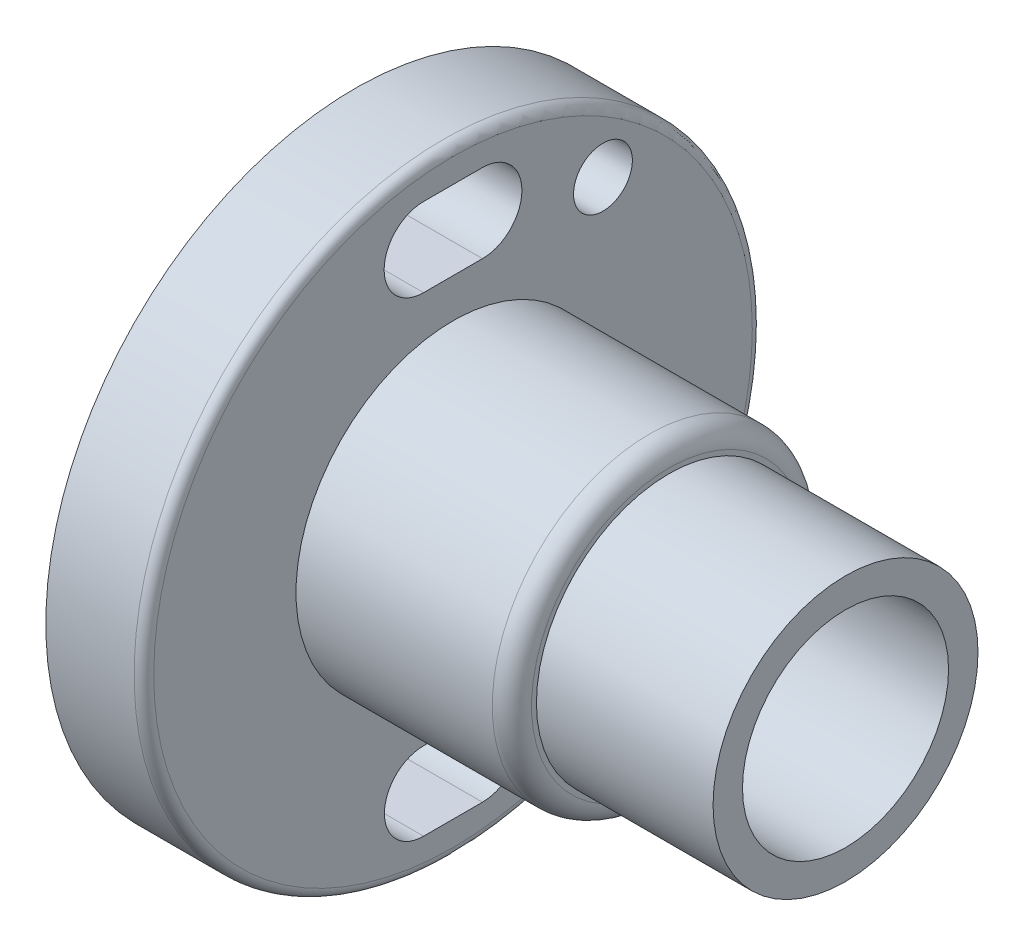
ISO-10303-21;
HEADER;
FILE_DESCRIPTION(('STEP AP214'),'2;1');
FILE_NAME('part.step','',(''),(''),'','','');
FILE_SCHEMA(('AUTOMOTIVE_DESIGN { 1 0 10303 214 1 1 1 1 }'));
ENDSEC;
DATA;
#1=APPLICATION_CONTEXT('core data for automotive mechanical design processes');
#2=APPLICATION_PROTOCOL_DEFINITION('international standard','automotive_design',2000,#1);
#3=PRODUCT_CONTEXT('',#1,'mechanical');
#4=PRODUCT('Part','Part','',(#3));
#5=PRODUCT_RELATED_PRODUCT_CATEGORY('part','',(#4));
#6=PRODUCT_DEFINITION_FORMATION('','',#4);
#7=PRODUCT_DEFINITION_CONTEXT('part definition',#1,'design');
#8=PRODUCT_DEFINITION('design','',#6,#7);
#9=PRODUCT_DEFINITION_SHAPE('','',#8);
#10=(LENGTH_UNIT() NAMED_UNIT(*) SI_UNIT(.MILLI.,.METRE.));
#11=(NAMED_UNIT(*) PLANE_ANGLE_UNIT() SI_UNIT($,.RADIAN.));
#12=(NAMED_UNIT(*) SI_UNIT($,.STERADIAN.) SOLID_ANGLE_UNIT());
#13=UNCERTAINTY_MEASURE_WITH_UNIT(LENGTH_MEASURE(1.E-05),#10,'distance_accuracy_value','');
#14=(GEOMETRIC_REPRESENTATION_CONTEXT(3) GLOBAL_UNCERTAINTY_ASSIGNED_CONTEXT((#13)) GLOBAL_UNIT_ASSIGNED_CONTEXT((#10,
#11,#12)) REPRESENTATION_CONTEXT('',''));
#15=CARTESIAN_POINT('',(0.,0.,0.));
#16=DIRECTION('',(0.,0.,1.));
#17=DIRECTION('',(1.,0.,0.));
#18=AXIS2_PLACEMENT_3D('',#15,#16,#17);
#19=CARTESIAN_POINT('',(5.5,0.,0.));
#20=DIRECTION('',(-1.,0.,0.));
#21=DIRECTION('',(0.,0.,1.));
#22=AXIS2_PLACEMENT_3D('',#19,#20,#21);
#23=CYLINDRICAL_SURFACE('',#22,16.);
#24=CARTESIAN_POINT('',(5.5,0.,0.));
#25=DIRECTION('',(-1.,0.,0.));
#26=DIRECTION('',(0.,0.,1.));
#27=AXIS2_PLACEMENT_3D('',#24,#25,#26);
#28=CIRCLE('',#27,16.);
#29=CARTESIAN_POINT('',(5.5,0.,16.));
#30=VERTEX_POINT('',#29);
#31=EDGE_CURVE('E215',#30,#30,#28,.T.);
#32=ORIENTED_EDGE('',*,*,#31,.F.);
#33=EDGE_LOOP('',(#32));
#34=FACE_BOUND('',#33,.T.);
#35=CARTESIAN_POINT('',(2.5,0.,0.));
#36=DIRECTION('',(-1.,0.,0.));
#37=DIRECTION('',(0.,0.,1.));
#38=AXIS2_PLACEMENT_3D('',#35,#36,#37);
#39=CIRCLE('',#38,16.);
#40=CARTESIAN_POINT('',(2.5,0.,16.));
#41=VERTEX_POINT('',#40);
#42=EDGE_CURVE('E210',#41,#41,#39,.F.);
#43=ORIENTED_EDGE('',*,*,#42,.F.);
#44=EDGE_LOOP('',(#43));
#45=FACE_BOUND('',#44,.T.);
#46=ADVANCED_FACE('F39',(#34,#45),#23,.F.);
#47=CARTESIAN_POINT('',(15.5,0.,0.));
#48=DIRECTION('',(-1.,0.,0.));
#49=DIRECTION('',(0.,0.,1.));
#50=AXIS2_PLACEMENT_3D('',#47,#48,#49);
#51=CYLINDRICAL_SURFACE('',#50,14.5);
#52=CARTESIAN_POINT('',(15.5,0.,0.));
#53=DIRECTION('',(-1.,0.,0.));
#54=DIRECTION('',(0.,0.,1.));
#55=AXIS2_PLACEMENT_3D('',#52,#53,#54);
#56=CIRCLE('',#55,14.5);
#57=CARTESIAN_POINT('',(15.5,0.,14.5));
#58=VERTEX_POINT('',#57);
#59=EDGE_CURVE('E220',#58,#58,#56,.T.);
#60=ORIENTED_EDGE('',*,*,#59,.F.);
#61=EDGE_LOOP('',(#60));
#62=FACE_BOUND('',#61,.T.);
#63=CARTESIAN_POINT('',(5.5,0.,0.));
#64=DIRECTION('',(-1.,0.,0.));
#65=DIRECTION('',(0.,0.,1.));
#66=AXIS2_PLACEMENT_3D('',#63,#64,#65);
#67=CIRCLE('',#66,14.5);
#68=CARTESIAN_POINT('',(5.5,0.,14.5));
#69=VERTEX_POINT('',#68);
#70=EDGE_CURVE('E219',#69,#69,#67,.F.);
#71=ORIENTED_EDGE('',*,*,#70,.F.);
#72=EDGE_LOOP('',(#71));
#73=FACE_BOUND('',#72,.T.);
#74=ADVANCED_FACE('F284',(#62,#73),#51,.F.);
#75=CARTESIAN_POINT('',(17.7,0.,0.));
#76=DIRECTION('',(-1.,0.,0.));
#77=DIRECTION('',(0.,0.,1.));
#78=AXIS2_PLACEMENT_3D('',#75,#76,#77);
#79=CYLINDRICAL_SURFACE('',#78,13.95);
#80=CARTESIAN_POINT('',(17.7,0.,0.));
#81=DIRECTION('',(-1.,0.,0.));
#82=DIRECTION('',(0.,0.,1.));
#83=AXIS2_PLACEMENT_3D('',#80,#81,#82);
#84=CIRCLE('',#83,13.95);
#85=CARTESIAN_POINT('',(17.7,0.,13.95));
#86=VERTEX_POINT('',#85);
#87=EDGE_CURVE('E225',#86,#86,#84,.T.);
#88=ORIENTED_EDGE('',*,*,#87,.F.);
#89=EDGE_LOOP('',(#88));
#90=FACE_BOUND('',#89,.T.);
#91=CARTESIAN_POINT('',(15.5,0.,0.));
#92=DIRECTION('',(-1.,0.,0.));
#93=DIRECTION('',(0.,0.,1.));
#94=AXIS2_PLACEMENT_3D('',#91,#92,#93);
#95=CIRCLE('',#94,13.95);
#96=CARTESIAN_POINT('',(15.5,0.,13.95));
#97=VERTEX_POINT('',#96);
#98=EDGE_CURVE('E224',#97,#97,#95,.F.);
#99=ORIENTED_EDGE('',*,*,#98,.F.);
#100=EDGE_LOOP('',(#99));
#101=FACE_BOUND('',#100,.T.);
#102=ADVANCED_FACE('F290',(#90,#101),#79,.F.);
#103=CARTESIAN_POINT('',(23.5,0.,0.));
#104=DIRECTION('',(-1.,0.,0.));
#105=DIRECTION('',(0.,0.,1.));
#106=AXIS2_PLACEMENT_3D('',#103,#104,#105);
#107=CYLINDRICAL_SURFACE('',#106,12.7);
#108=CARTESIAN_POINT('',(23.5,0.,0.));
#109=DIRECTION('',(-1.,0.,0.));
#110=DIRECTION('',(0.,0.,1.));
#111=AXIS2_PLACEMENT_3D('',#108,#109,#110);
#112=CIRCLE('',#111,12.7);
#113=CARTESIAN_POINT('',(23.5,0.,12.7));
#114=VERTEX_POINT('',#113);
#115=EDGE_CURVE('E230',#114,#114,#112,.T.);
#116=ORIENTED_EDGE('',*,*,#115,.F.);
#117=EDGE_LOOP('',(#116));
#118=FACE_BOUND('',#117,.T.);
#119=CARTESIAN_POINT('',(17.7,0.,0.));
#120=DIRECTION('',(-1.,0.,0.));
#121=DIRECTION('',(0.,0.,1.));
#122=AXIS2_PLACEMENT_3D('',#119,#120,#121);
#123=CIRCLE('',#122,12.7);
#124=CARTESIAN_POINT('',(17.7,0.,12.7));
#125=VERTEX_POINT('',#124);
#126=EDGE_CURVE('E229',#125,#125,#123,.F.);
#127=ORIENTED_EDGE('',*,*,#126,.F.);
#128=EDGE_LOOP('',(#127));
#129=FACE_BOUND('',#128,.T.);
#130=ADVANCED_FACE('F309',(#118,#129),#107,.F.);
#131=CARTESIAN_POINT('',(150.,0.,0.));
#132=DIRECTION('',(-1.,0.,0.));
#133=DIRECTION('',(0.,0.,1.));
#134=AXIS2_PLACEMENT_3D('',#131,#132,#133);
#135=CYLINDRICAL_SURFACE('',#134,10.5);
#136=CARTESIAN_POINT('',(50.,0.,0.));
#137=DIRECTION('',(1.,0.,0.));
#138=DIRECTION('',(0.,0.,-1.));
#139=AXIS2_PLACEMENT_3D('',#136,#137,#138);
#140=CIRCLE('',#139,10.5);
#141=CARTESIAN_POINT('',(50.,0.,-10.5));
#142=VERTEX_POINT('',#141);
#143=EDGE_CURVE('E240',#142,#142,#140,.T.);
#144=ORIENTED_EDGE('',*,*,#143,.T.);
#145=EDGE_LOOP('',(#144));
#146=FACE_BOUND('',#145,.T.);
#147=CARTESIAN_POINT('',(23.5,0.,0.));
#148=DIRECTION('',(-1.,0.,0.));
#149=DIRECTION('',(0.,0.,1.));
#150=AXIS2_PLACEMENT_3D('',#147,#148,#149);
#151=CIRCLE('',#150,10.5);
#152=CARTESIAN_POINT('',(23.5,0.,10.5));
#153=VERTEX_POINT('',#152);
#154=EDGE_CURVE('E234',#153,#153,#151,.F.);
#155=ORIENTED_EDGE('',*,*,#154,.F.);
#156=EDGE_LOOP('',(#155));
#157=FACE_BOUND('',#156,.T.);
#158=ADVANCED_FACE('F316',(#146,#157),#135,.F.);
#159=CARTESIAN_POINT('',(10.,0.,0.));
#160=DIRECTION('',(-1.,0.,0.));
#161=DIRECTION('',(0.,0.,1.));
#162=AXIS2_PLACEMENT_3D('',#159,#160,#161);
#163=CYLINDRICAL_SURFACE('',#162,31.5);
#164=CARTESIAN_POINT('',(9.,0.,0.));
#165=DIRECTION('',(1.,0.,0.));
#166=DIRECTION('',(0.,0.,-1.));
#167=AXIS2_PLACEMENT_3D('',#164,#165,#166);
#168=CIRCLE('',#167,31.5);
#169=CARTESIAN_POINT('',(9.,0.,-31.5));
#170=VERTEX_POINT('',#169);
#171=EDGE_CURVE('E256',#170,#170,#168,.F.);
#172=ORIENTED_EDGE('',*,*,#171,.T.);
#173=EDGE_LOOP('',(#172));
#174=FACE_BOUND('',#173,.T.);
#175=CARTESIAN_POINT('',(0.,0.,0.));
#176=DIRECTION('',(1.,0.,0.));
#177=DIRECTION('',(0.,0.,-1.));
#178=AXIS2_PLACEMENT_3D('',#175,#176,#177);
#179=CIRCLE('',#178,31.5);
#180=CARTESIAN_POINT('',(0.,0.,-31.5));
#181=VERTEX_POINT('',#180);
#182=EDGE_CURVE('E239',#181,#181,#179,.T.);
#183=ORIENTED_EDGE('',*,*,#182,.T.);
#184=EDGE_LOOP('',(#183));
#185=FACE_BOUND('',#184,.T.);
#186=ADVANCED_FACE('F320',(#174,#185),#163,.T.);
#187=CARTESIAN_POINT('',(10.,0.,0.));
#188=DIRECTION('',(1.,0.,0.));
#189=DIRECTION('',(0.,0.,-1.));
#190=AXIS2_PLACEMENT_3D('',#187,#188,#189);
#191=PLANE('',#190);
#192=CARTESIAN_POINT('',(10.,24.,-3.));
#193=DIRECTION('',(1.,0.,0.));
#194=DIRECTION('',(0.,0.,-1.));
#195=AXIS2_PLACEMENT_3D('',#192,#193,#194);
#196=CIRCLE('',#195,4.02084930156254);
#197=CARTESIAN_POINT('',(10.,19.9791506984375,-3.));
#198=VERTEX_POINT('',#197);
#199=CARTESIAN_POINT('',(10.,28.0208493015625,-3.));
#200=VERTEX_POINT('',#199);
#201=EDGE_CURVE('E150',#198,#200,#196,.T.);
#202=ORIENTED_EDGE('',*,*,#201,.F.);
#203=DIRECTION('',(0.,0.,-1.));
#204=VECTOR('',#203,1.);
#205=CARTESIAN_POINT('',(10.,19.9791506984375,0.));
#206=LINE('',#205,#204);
#207=CARTESIAN_POINT('',(10.,19.9791506984375,3.));
#208=VERTEX_POINT('',#207);
#209=EDGE_CURVE('E138',#208,#198,#206,.T.);
#210=ORIENTED_EDGE('',*,*,#209,.F.);
#211=CARTESIAN_POINT('',(10.,24.,3.));
#212=DIRECTION('',(1.,0.,0.));
#213=DIRECTION('',(0.,0.,-1.));
#214=AXIS2_PLACEMENT_3D('',#211,#212,#213);
#215=CIRCLE('',#214,4.02084930156254);
#216=CARTESIAN_POINT('',(10.,28.0208493015625,3.));
#217=VERTEX_POINT('',#216);
#218=EDGE_CURVE('E113',#217,#208,#215,.T.);
#219=ORIENTED_EDGE('',*,*,#218,.F.);
#220=DIRECTION('',(0.,0.,1.));
#221=VECTOR('',#220,1.);
#222=CARTESIAN_POINT('',(10.,28.0208493015625,0.));
#223=LINE('',#222,#221);
#224=EDGE_CURVE('E147',#200,#217,#223,.T.);
#225=ORIENTED_EDGE('',*,*,#224,.F.);
#226=EDGE_LOOP('',(#202,#210,#219,#225));
#227=FACE_BOUND('',#226,.T.);
#228=DIRECTION('',(0.,0.,-1.));
#229=VECTOR('',#228,1.);
#230=CARTESIAN_POINT('',(10.,-27.9908190041573,0.));
#231=LINE('',#230,#229);
#232=CARTESIAN_POINT('',(10.,-27.9908190041573,3.00000000000001));
#233=VERTEX_POINT('',#232);
#234=CARTESIAN_POINT('',(10.,-27.9908190041573,-2.99999999999999));
#235=VERTEX_POINT('',#234);
#236=EDGE_CURVE('E191',#233,#235,#231,.T.);
#237=ORIENTED_EDGE('',*,*,#236,.F.);
#238=CARTESIAN_POINT('',(10.,-24.,3.00000000000001));
#239=DIRECTION('',(1.,0.,0.));
#240=DIRECTION('',(0.,0.,-1.));
#241=AXIS2_PLACEMENT_3D('',#238,#239,#240);
#242=CIRCLE('',#241,3.99081900415731);
#243=CARTESIAN_POINT('',(10.,-20.0091809958427,3.00000000000001));
#244=VERTEX_POINT('',#243);
#245=EDGE_CURVE('E172',#244,#233,#242,.T.);
#246=ORIENTED_EDGE('',*,*,#245,.F.);
#247=DIRECTION('',(0.,0.,-1.));
#248=VECTOR('',#247,1.);
#249=CARTESIAN_POINT('',(10.,-20.0091809958427,0.));
#250=LINE('',#249,#248);
#251=CARTESIAN_POINT('',(10.,-20.0091809958427,-2.99999999999999));
#252=VERTEX_POINT('',#251);
#253=EDGE_CURVE('E184',#244,#252,#250,.T.);
#254=ORIENTED_EDGE('',*,*,#253,.T.);
#255=CARTESIAN_POINT('',(10.,-24.,-2.99999999999999));
#256=DIRECTION('',(1.,0.,0.));
#257=DIRECTION('',(0.,0.,-1.));
#258=AXIS2_PLACEMENT_3D('',#255,#256,#257);
#259=CIRCLE('',#258,3.99081900415731);
#260=EDGE_CURVE('E188',#235,#252,#259,.T.);
#261=ORIENTED_EDGE('',*,*,#260,.F.);
#262=EDGE_LOOP('',(#237,#246,#254,#261));
#263=FACE_BOUND('',#262,.T.);
#264=CARTESIAN_POINT('',(10.,-21.0344418537486,-15.2824165596043));
#265=DIRECTION('',(1.,0.,0.));
#266=DIRECTION('',(0.,0.,-1.));
#267=AXIS2_PLACEMENT_3D('',#264,#265,#266);
#268=CIRCLE('',#267,3.);
#269=CARTESIAN_POINT('',(10.,-21.0344418537486,-18.2824165596043));
#270=VERTEX_POINT('',#269);
#271=EDGE_CURVE('E198',#270,#270,#268,.T.);
#272=ORIENTED_EDGE('',*,*,#271,.F.);
#273=EDGE_LOOP('',(#272));
#274=FACE_BOUND('',#273,.T.);
#275=CARTESIAN_POINT('',(10.,21.0310693999118,-15.2799663284682));
#276=DIRECTION('',(1.,0.,0.));
#277=DIRECTION('',(0.,0.,-1.));
#278=AXIS2_PLACEMENT_3D('',#275,#276,#277);
#279=CIRCLE('',#278,3.);
#280=CARTESIAN_POINT('',(10.,21.0310693999118,-18.2799663284682));
#281=VERTEX_POINT('',#280);
#282=EDGE_CURVE('E202',#281,#281,#279,.T.);
#283=ORIENTED_EDGE('',*,*,#282,.F.);
#284=EDGE_LOOP('',(#283));
#285=FACE_BOUND('',#284,.T.);
#286=CARTESIAN_POINT('',(10.,0.,0.));
#287=DIRECTION('',(1.,0.,0.));
#288=DIRECTION('',(0.,0.,-1.));
#289=AXIS2_PLACEMENT_3D('',#286,#287,#288);
#290=CIRCLE('',#289,30.5);
#291=CARTESIAN_POINT('',(10.,0.,-30.5));
#292=VERTEX_POINT('',#291);
#293=EDGE_CURVE('E245',#292,#292,#290,.T.);
#294=ORIENTED_EDGE('',*,*,#293,.T.);
#295=EDGE_LOOP('',(#294));
#296=FACE_BOUND('',#295,.T.);
#297=CARTESIAN_POINT('',(10.,0.,0.));
#298=DIRECTION('',(1.,0.,0.));
#299=DIRECTION('',(0.,0.,-1.));
#300=AXIS2_PLACEMENT_3D('',#297,#298,#299);
#301=CIRCLE('',#300,16.);
#302=CARTESIAN_POINT('',(10.,0.,-16.));
#303=VERTEX_POINT('',#302);
#304=EDGE_CURVE('E246',#303,#303,#301,.T.);
#305=ORIENTED_EDGE('',*,*,#304,.F.);
#306=EDGE_LOOP('',(#305));
#307=FACE_BOUND('',#306,.T.);
#308=ADVANCED_FACE('F339',(#227,#263,#274,#285,#296,#307),#191,.T.);
#309=CARTESIAN_POINT('',(0.,0.,0.));
#310=DIRECTION('',(1.,0.,0.));
#311=DIRECTION('',(0.,0.,-1.));
#312=AXIS2_PLACEMENT_3D('',#309,#310,#311);
#313=PLANE('',#312);
#314=DIRECTION('',(0.,0.,1.));
#315=VECTOR('',#314,1.);
#316=CARTESIAN_POINT('',(0.,19.9791506984375,-3.));
#317=LINE('',#316,#315);
#318=CARTESIAN_POINT('',(0.,19.9791506984375,-3.));
#319=VERTEX_POINT('',#318);
#320=CARTESIAN_POINT('',(0.,19.9791506984375,3.));
#321=VERTEX_POINT('',#320);
#322=EDGE_CURVE('E120',#319,#321,#317,.T.);
#323=ORIENTED_EDGE('',*,*,#322,.F.);
#324=CARTESIAN_POINT('',(0.,24.,-3.));
#325=DIRECTION('',(-1.,0.,0.));
#326=DIRECTION('',(0.,0.,1.));
#327=AXIS2_PLACEMENT_3D('',#324,#325,#326);
#328=CIRCLE('',#327,4.02084930156254);
#329=CARTESIAN_POINT('',(0.,28.0208493015625,-3.));
#330=VERTEX_POINT('',#329);
#331=EDGE_CURVE('E65',#330,#319,#328,.T.);
#332=ORIENTED_EDGE('',*,*,#331,.F.);
#333=DIRECTION('',(0.,0.,-1.));
#334=VECTOR('',#333,1.);
#335=CARTESIAN_POINT('',(0.,28.0208493015625,-3.));
#336=LINE('',#335,#334);
#337=CARTESIAN_POINT('',(0.,28.0208493015625,3.));
#338=VERTEX_POINT('',#337);
#339=EDGE_CURVE('E128',#338,#330,#336,.T.);
#340=ORIENTED_EDGE('',*,*,#339,.F.);
#341=CARTESIAN_POINT('',(0.,24.,3.));
#342=DIRECTION('',(-1.,0.,0.));
#343=DIRECTION('',(0.,0.,1.));
#344=AXIS2_PLACEMENT_3D('',#341,#342,#343);
#345=CIRCLE('',#344,4.02084930156254);
#346=EDGE_CURVE('E110',#321,#338,#345,.T.);
#347=ORIENTED_EDGE('',*,*,#346,.F.);
#348=EDGE_LOOP('',(#323,#332,#340,#347));
#349=FACE_BOUND('',#348,.T.);
#350=CARTESIAN_POINT('',(0.,-24.,3.00000000000001));
#351=DIRECTION('',(-1.,0.,0.));
#352=DIRECTION('',(0.,0.,1.));
#353=AXIS2_PLACEMENT_3D('',#350,#351,#352);
#354=CIRCLE('',#353,3.99081900415731);
#355=CARTESIAN_POINT('',(0.,-27.9908190041573,3.00000000000001));
#356=VERTEX_POINT('',#355);
#357=CARTESIAN_POINT('',(0.,-20.0091809958427,3.00000000000001));
#358=VERTEX_POINT('',#357);
#359=EDGE_CURVE('E156',#356,#358,#354,.T.);
#360=ORIENTED_EDGE('',*,*,#359,.F.);
#361=DIRECTION('',(0.,0.,1.));
#362=VECTOR('',#361,1.);
#363=CARTESIAN_POINT('',(0.,-27.9908190041573,0.));
#364=LINE('',#363,#362);
#365=CARTESIAN_POINT('',(0.,-27.9908190041573,-2.99999999999999));
#366=VERTEX_POINT('',#365);
#367=EDGE_CURVE('E153',#366,#356,#364,.T.);
#368=ORIENTED_EDGE('',*,*,#367,.F.);
#369=CARTESIAN_POINT('',(0.,-24.,-2.99999999999999));
#370=DIRECTION('',(-1.,0.,0.));
#371=DIRECTION('',(0.,0.,1.));
#372=AXIS2_PLACEMENT_3D('',#369,#370,#371);
#373=CIRCLE('',#372,3.99081900415731);
#374=CARTESIAN_POINT('',(0.,-20.0091809958427,-2.99999999999999));
#375=VERTEX_POINT('',#374);
#376=EDGE_CURVE('E164',#375,#366,#373,.T.);
#377=ORIENTED_EDGE('',*,*,#376,.F.);
#378=DIRECTION('',(0.,0.,1.));
#379=VECTOR('',#378,1.);
#380=CARTESIAN_POINT('',(0.,-20.0091809958427,0.));
#381=LINE('',#380,#379);
#382=EDGE_CURVE('E160',#375,#358,#381,.T.);
#383=ORIENTED_EDGE('',*,*,#382,.T.);
#384=EDGE_LOOP('',(#360,#368,#377,#383));
#385=FACE_BOUND('',#384,.T.);
#386=CARTESIAN_POINT('',(0.,-21.0344418537486,-15.2824165596043));
#387=DIRECTION('',(-1.,0.,0.));
#388=DIRECTION('',(0.,0.,1.));
#389=AXIS2_PLACEMENT_3D('',#386,#387,#388);
#390=CIRCLE('',#389,3.);
#391=CARTESIAN_POINT('',(0.,-21.0344418537486,-12.2824165596043));
#392=VERTEX_POINT('',#391);
#393=EDGE_CURVE('E194',#392,#392,#390,.T.);
#394=ORIENTED_EDGE('',*,*,#393,.F.);
#395=EDGE_LOOP('',(#394));
#396=FACE_BOUND('',#395,.T.);
#397=CARTESIAN_POINT('',(0.,21.0310693999118,-15.2799663284682));
#398=DIRECTION('',(1.,0.,0.));
#399=DIRECTION('',(0.,0.,-1.));
#400=AXIS2_PLACEMENT_3D('',#397,#398,#399);
#401=CIRCLE('',#400,3.);
#402=CARTESIAN_POINT('',(0.,21.0310693999118,-18.2799663284682));
#403=VERTEX_POINT('',#402);
#404=EDGE_CURVE('E43',#403,#403,#401,.T.);
#405=ORIENTED_EDGE('',*,*,#404,.T.);
#406=EDGE_LOOP('',(#405));
#407=FACE_BOUND('',#406,.T.);
#408=CARTESIAN_POINT('',(0.,0.,0.));
#409=DIRECTION('',(-1.,0.,0.));
#410=DIRECTION('',(0.,0.,1.));
#411=AXIS2_PLACEMENT_3D('',#408,#409,#410);
#412=CIRCLE('',#411,19.5);
#413=CARTESIAN_POINT('',(0.,0.,19.5));
#414=VERTEX_POINT('',#413);
#415=EDGE_CURVE('E211',#414,#414,#412,.T.);
#416=ORIENTED_EDGE('',*,*,#415,.F.);
#417=EDGE_LOOP('',(#416));
#418=FACE_BOUND('',#417,.T.);
#419=ORIENTED_EDGE('',*,*,#182,.F.);
#420=EDGE_LOOP('',(#419));
#421=FACE_BOUND('',#420,.T.);
#422=ADVANCED_FACE('F125',(#349,#385,#396,#407,#418,#421),#313,.F.);
#423=CARTESIAN_POINT('',(32.,0.,0.));
#424=DIRECTION('',(-1.,0.,0.));
#425=DIRECTION('',(0.,0.,1.));
#426=AXIS2_PLACEMENT_3D('',#423,#424,#425);
#427=CYLINDRICAL_SURFACE('',#426,16.);
#428=CARTESIAN_POINT('',(30.,0.,0.));
#429=DIRECTION('',(1.,0.,0.));
#430=DIRECTION('',(0.,0.,-1.));
#431=AXIS2_PLACEMENT_3D('',#428,#429,#430);
#432=CIRCLE('',#431,16.);
#433=CARTESIAN_POINT('',(30.,0.,-16.));
#434=VERTEX_POINT('',#433);
#435=EDGE_CURVE('E11',#434,#434,#432,.F.);
#436=ORIENTED_EDGE('',*,*,#435,.T.);
#437=EDGE_LOOP('',(#436));
#438=FACE_BOUND('',#437,.T.);
#439=ORIENTED_EDGE('',*,*,#304,.T.);
#440=EDGE_LOOP('',(#439));
#441=FACE_BOUND('',#440,.T.);
#442=ADVANCED_FACE('F334',(#438,#441),#427,.T.);
#443=CARTESIAN_POINT('',(32.,0.,0.));
#444=DIRECTION('',(1.,0.,0.));
#445=DIRECTION('',(0.,0.,-1.));
#446=AXIS2_PLACEMENT_3D('',#443,#444,#445);
#447=PLANE('',#446);
#448=CARTESIAN_POINT('',(32.,0.,0.));
#449=DIRECTION('',(1.,0.,0.));
#450=DIRECTION('',(0.,0.,-1.));
#451=AXIS2_PLACEMENT_3D('',#448,#449,#450);
#452=CIRCLE('',#451,14.);
#453=CARTESIAN_POINT('',(32.,0.,-14.));
#454=VERTEX_POINT('',#453);
#455=EDGE_CURVE('E49',#454,#454,#452,.T.);
#456=ORIENTED_EDGE('',*,*,#455,.T.);
#457=EDGE_LOOP('',(#456));
#458=FACE_BOUND('',#457,.T.);
#459=CARTESIAN_POINT('',(32.,0.,0.));
#460=DIRECTION('',(1.,0.,0.));
#461=DIRECTION('',(0.,0.,-1.));
#462=AXIS2_PLACEMENT_3D('',#459,#460,#461);
#463=CIRCLE('',#462,13.5);
#464=CARTESIAN_POINT('',(32.,0.,-13.5));
#465=VERTEX_POINT('',#464);
#466=EDGE_CURVE('E241',#465,#465,#463,.T.);
#467=ORIENTED_EDGE('',*,*,#466,.F.);
#468=EDGE_LOOP('',(#467));
#469=FACE_BOUND('',#468,.T.);
#470=ADVANCED_FACE('F330',(#458,#469),#447,.T.);
#471=CARTESIAN_POINT('',(50.,0.,0.));
#472=DIRECTION('',(-1.,0.,0.));
#473=DIRECTION('',(0.,0.,1.));
#474=AXIS2_PLACEMENT_3D('',#471,#472,#473);
#475=CYLINDRICAL_SURFACE('',#474,13.5);
#476=CARTESIAN_POINT('',(50.,0.,0.));
#477=DIRECTION('',(1.,0.,0.));
#478=DIRECTION('',(0.,0.,-1.));
#479=AXIS2_PLACEMENT_3D('',#476,#477,#478);
#480=CIRCLE('',#479,13.5);
#481=CARTESIAN_POINT('',(50.,0.,-13.5));
#482=VERTEX_POINT('',#481);
#483=EDGE_CURVE('E235',#482,#482,#480,.T.);
#484=ORIENTED_EDGE('',*,*,#483,.F.);
#485=EDGE_LOOP('',(#484));
#486=FACE_BOUND('',#485,.T.);
#487=ORIENTED_EDGE('',*,*,#466,.T.);
#488=EDGE_LOOP('',(#487));
#489=FACE_BOUND('',#488,.T.);
#490=ADVANCED_FACE('F326',(#486,#489),#475,.T.);
#491=CARTESIAN_POINT('',(50.,0.,0.));
#492=DIRECTION('',(1.,0.,0.));
#493=DIRECTION('',(0.,0.,-1.));
#494=AXIS2_PLACEMENT_3D('',#491,#492,#493);
#495=PLANE('',#494);
#496=ORIENTED_EDGE('',*,*,#143,.F.);
#497=EDGE_LOOP('',(#496));
#498=FACE_BOUND('',#497,.T.);
#499=ORIENTED_EDGE('',*,*,#483,.T.);
#500=EDGE_LOOP('',(#499));
#501=FACE_BOUND('',#500,.T.);
#502=ADVANCED_FACE('F322',(#498,#501),#495,.T.);
#503=CARTESIAN_POINT('',(9.,0.,0.));
#504=DIRECTION('',(1.,0.,0.));
#505=DIRECTION('',(0.,0.,-1.));
#506=AXIS2_PLACEMENT_3D('',#503,#504,#505);
#507=TOROIDAL_SURFACE('',#506,30.5,1.);
#508=ORIENTED_EDGE('',*,*,#171,.F.);
#509=EDGE_LOOP('',(#508));
#510=FACE_BOUND('',#509,.T.);
#511=ORIENTED_EDGE('',*,*,#293,.F.);
#512=EDGE_LOOP('',(#511));
#513=FACE_BOUND('',#512,.T.);
#514=ADVANCED_FACE('F325',(#510,#513),#507,.T.);
#515=CARTESIAN_POINT('',(30.,0.,0.));
#516=DIRECTION('',(1.,0.,0.));
#517=DIRECTION('',(0.,0.,-1.));
#518=AXIS2_PLACEMENT_3D('',#515,#516,#517);
#519=TOROIDAL_SURFACE('',#518,14.,2.);
#520=ORIENTED_EDGE('',*,*,#435,.F.);
#521=EDGE_LOOP('',(#520));
#522=FACE_BOUND('',#521,.T.);
#523=ORIENTED_EDGE('',*,*,#455,.F.);
#524=EDGE_LOOP('',(#523));
#525=FACE_BOUND('',#524,.T.);
#526=ADVANCED_FACE('F41',(#522,#525),#519,.T.);
#527=CARTESIAN_POINT('',(23.5,0.,0.));
#528=DIRECTION('',(-1.,0.,0.));
#529=DIRECTION('',(0.,0.,1.));
#530=AXIS2_PLACEMENT_3D('',#527,#528,#529);
#531=PLANE('',#530);
#532=ORIENTED_EDGE('',*,*,#115,.T.);
#533=EDGE_LOOP('',(#532));
#534=FACE_BOUND('',#533,.T.);
#535=ORIENTED_EDGE('',*,*,#154,.T.);
#536=EDGE_LOOP('',(#535));
#537=FACE_BOUND('',#536,.T.);
#538=ADVANCED_FACE('F305',(#534,#537),#531,.T.);
#539=CARTESIAN_POINT('',(17.7,0.,0.));
#540=DIRECTION('',(-1.,0.,0.));
#541=DIRECTION('',(0.,0.,1.));
#542=AXIS2_PLACEMENT_3D('',#539,#540,#541);
#543=PLANE('',#542);
#544=ORIENTED_EDGE('',*,*,#87,.T.);
#545=EDGE_LOOP('',(#544));
#546=FACE_BOUND('',#545,.T.);
#547=ORIENTED_EDGE('',*,*,#126,.T.);
#548=EDGE_LOOP('',(#547));
#549=FACE_BOUND('',#548,.T.);
#550=ADVANCED_FACE('F300',(#546,#549),#543,.T.);
#551=CARTESIAN_POINT('',(15.5,0.,0.));
#552=DIRECTION('',(-1.,0.,0.));
#553=DIRECTION('',(0.,0.,1.));
#554=AXIS2_PLACEMENT_3D('',#551,#552,#553);
#555=PLANE('',#554);
#556=ORIENTED_EDGE('',*,*,#59,.T.);
#557=EDGE_LOOP('',(#556));
#558=FACE_BOUND('',#557,.T.);
#559=ORIENTED_EDGE('',*,*,#98,.T.);
#560=EDGE_LOOP('',(#559));
#561=FACE_BOUND('',#560,.T.);
#562=ADVANCED_FACE('F298',(#558,#561),#555,.T.);
#563=CARTESIAN_POINT('',(5.5,0.,0.));
#564=DIRECTION('',(-1.,0.,0.));
#565=DIRECTION('',(0.,0.,1.));
#566=AXIS2_PLACEMENT_3D('',#563,#564,#565);
#567=PLANE('',#566);
#568=ORIENTED_EDGE('',*,*,#31,.T.);
#569=EDGE_LOOP('',(#568));
#570=FACE_BOUND('',#569,.T.);
#571=ORIENTED_EDGE('',*,*,#70,.T.);
#572=EDGE_LOOP('',(#571));
#573=FACE_BOUND('',#572,.T.);
#574=ADVANCED_FACE('F296',(#570,#573),#567,.T.);
#575=CARTESIAN_POINT('',(2.5,0.,0.));
#576=DIRECTION('',(-1.,0.,0.));
#577=DIRECTION('',(0.,0.,1.));
#578=AXIS2_PLACEMENT_3D('',#575,#576,#577);
#579=PLANE('',#578);
#580=CARTESIAN_POINT('',(2.5,0.,0.));
#581=DIRECTION('',(-1.,0.,0.));
#582=DIRECTION('',(0.,0.,1.));
#583=AXIS2_PLACEMENT_3D('',#580,#581,#582);
#584=CIRCLE('',#583,19.5);
#585=CARTESIAN_POINT('',(2.5,0.,19.5));
#586=VERTEX_POINT('',#585);
#587=EDGE_CURVE('E206',#586,#586,#584,.T.);
#588=ORIENTED_EDGE('',*,*,#587,.T.);
#589=EDGE_LOOP('',(#588));
#590=FACE_BOUND('',#589,.T.);
#591=ORIENTED_EDGE('',*,*,#42,.T.);
#592=EDGE_LOOP('',(#591));
#593=FACE_BOUND('',#592,.T.);
#594=ADVANCED_FACE('F281',(#590,#593),#579,.T.);
#595=CARTESIAN_POINT('',(2.5,0.,0.));
#596=DIRECTION('',(-1.,0.,0.));
#597=DIRECTION('',(0.,0.,1.));
#598=AXIS2_PLACEMENT_3D('',#595,#596,#597);
#599=CYLINDRICAL_SURFACE('',#598,19.5);
#600=ORIENTED_EDGE('',*,*,#587,.F.);
#601=EDGE_LOOP('',(#600));
#602=FACE_BOUND('',#601,.T.);
#603=ORIENTED_EDGE('',*,*,#415,.T.);
#604=EDGE_LOOP('',(#603));
#605=FACE_BOUND('',#604,.T.);
#606=ADVANCED_FACE('F401',(#602,#605),#599,.F.);
#607=CARTESIAN_POINT('',(-10.,21.0310693999118,-15.2799663284682));
#608=DIRECTION('',(1.,0.,0.));
#609=DIRECTION('',(0.,0.,-1.));
#610=AXIS2_PLACEMENT_3D('',#607,#608,#609);
#611=CYLINDRICAL_SURFACE('',#610,3.);
#612=ORIENTED_EDGE('',*,*,#282,.T.);
#613=EDGE_LOOP('',(#612));
#614=FACE_BOUND('',#613,.T.);
#615=ORIENTED_EDGE('',*,*,#404,.F.);
#616=EDGE_LOOP('',(#615));
#617=FACE_BOUND('',#616,.T.);
#618=ADVANCED_FACE('F409',(#614,#617),#611,.F.);
#619=CARTESIAN_POINT('',(20.,-21.0344418537486,-15.2824165596043));
#620=DIRECTION('',(-1.,0.,0.));
#621=DIRECTION('',(0.,0.,1.));
#622=AXIS2_PLACEMENT_3D('',#619,#620,#621);
#623=CYLINDRICAL_SURFACE('',#622,3.);
#624=ORIENTED_EDGE('',*,*,#271,.T.);
#625=EDGE_LOOP('',(#624));
#626=FACE_BOUND('',#625,.T.);
#627=ORIENTED_EDGE('',*,*,#393,.T.);
#628=EDGE_LOOP('',(#627));
#629=FACE_BOUND('',#628,.T.);
#630=ADVANCED_FACE('F416',(#626,#629),#623,.F.);
#631=CARTESIAN_POINT('',(20.,-27.9908190041573,0.));
#632=DIRECTION('',(0.,-1.,0.));
#633=DIRECTION('',(0.,0.,-1.));
#634=AXIS2_PLACEMENT_3D('',#631,#632,#633);
#635=PLANE('',#634);
#636=ORIENTED_EDGE('',*,*,#236,.T.);
#637=DIRECTION('',(-1.,0.,0.));
#638=VECTOR('',#637,1.);
#639=CARTESIAN_POINT('',(20.,-27.9908190041573,-2.99999999999999));
#640=LINE('',#639,#638);
#641=EDGE_CURVE('E169',#235,#366,#640,.T.);
#642=ORIENTED_EDGE('',*,*,#641,.T.);
#643=ORIENTED_EDGE('',*,*,#367,.T.);
#644=DIRECTION('',(-1.,0.,0.));
#645=VECTOR('',#644,1.);
#646=CARTESIAN_POINT('',(20.,-27.9908190041573,3.00000000000001));
#647=LINE('',#646,#645);
#648=EDGE_CURVE('E168',#233,#356,#647,.T.);
#649=ORIENTED_EDGE('',*,*,#648,.F.);
#650=EDGE_LOOP('',(#636,#642,#643,#649));
#651=FACE_BOUND('',#650,.T.);
#652=ADVANCED_FACE('F424',(#651),#635,.F.);
#653=CARTESIAN_POINT('',(20.,-24.,-2.99999999999999));
#654=DIRECTION('',(-1.,0.,0.));
#655=DIRECTION('',(0.,0.,1.));
#656=AXIS2_PLACEMENT_3D('',#653,#654,#655);
#657=CYLINDRICAL_SURFACE('',#656,3.99081900415731);
#658=ORIENTED_EDGE('',*,*,#260,.T.);
#659=DIRECTION('',(-1.,0.,0.));
#660=VECTOR('',#659,1.);
#661=CARTESIAN_POINT('',(20.,-20.0091809958427,-2.99999999999999));
#662=LINE('',#661,#660);
#663=EDGE_CURVE('E173',#252,#375,#662,.T.);
#664=ORIENTED_EDGE('',*,*,#663,.T.);
#665=ORIENTED_EDGE('',*,*,#376,.T.);
#666=ORIENTED_EDGE('',*,*,#641,.F.);
#667=EDGE_LOOP('',(#658,#664,#665,#666));
#668=FACE_BOUND('',#667,.T.);
#669=ADVANCED_FACE('F432',(#668),#657,.F.);
#670=CARTESIAN_POINT('',(20.,-20.0091809958427,0.));
#671=DIRECTION('',(0.,-1.,0.));
#672=DIRECTION('',(0.,0.,-1.));
#673=AXIS2_PLACEMENT_3D('',#670,#671,#672);
#674=PLANE('',#673);
#675=DIRECTION('',(-1.,0.,0.));
#676=VECTOR('',#675,1.);
#677=CARTESIAN_POINT('',(20.,-20.0091809958427,3.00000000000001));
#678=LINE('',#677,#676);
#679=EDGE_CURVE('E176',#244,#358,#678,.T.);
#680=ORIENTED_EDGE('',*,*,#679,.T.);
#681=ORIENTED_EDGE('',*,*,#382,.F.);
#682=ORIENTED_EDGE('',*,*,#663,.F.);
#683=ORIENTED_EDGE('',*,*,#253,.F.);
#684=EDGE_LOOP('',(#680,#681,#682,#683));
#685=FACE_BOUND('',#684,.T.);
#686=ADVANCED_FACE('F440',(#685),#674,.T.);
#687=CARTESIAN_POINT('',(20.,-24.,3.00000000000001));
#688=DIRECTION('',(-1.,0.,0.));
#689=DIRECTION('',(0.,0.,1.));
#690=AXIS2_PLACEMENT_3D('',#687,#688,#689);
#691=CYLINDRICAL_SURFACE('',#690,3.99081900415731);
#692=ORIENTED_EDGE('',*,*,#245,.T.);
#693=ORIENTED_EDGE('',*,*,#648,.T.);
#694=ORIENTED_EDGE('',*,*,#359,.T.);
#695=ORIENTED_EDGE('',*,*,#679,.F.);
#696=EDGE_LOOP('',(#692,#693,#694,#695));
#697=FACE_BOUND('',#696,.T.);
#698=ADVANCED_FACE('F448',(#697),#691,.F.);
#699=CARTESIAN_POINT('',(20.,24.,-3.));
#700=DIRECTION('',(-1.,0.,0.));
#701=DIRECTION('',(0.,0.,1.));
#702=AXIS2_PLACEMENT_3D('',#699,#700,#701);
#703=CYLINDRICAL_SURFACE('',#702,4.02084930156254);
#704=ORIENTED_EDGE('',*,*,#201,.T.);
#705=DIRECTION('',(-1.,0.,0.));
#706=VECTOR('',#705,1.);
#707=CARTESIAN_POINT('',(20.,28.0208493015625,-3.));
#708=LINE('',#707,#706);
#709=EDGE_CURVE('E135',#200,#330,#708,.T.);
#710=ORIENTED_EDGE('',*,*,#709,.T.);
#711=ORIENTED_EDGE('',*,*,#331,.T.);
#712=DIRECTION('',(-1.,0.,0.));
#713=VECTOR('',#712,1.);
#714=CARTESIAN_POINT('',(20.,19.9791506984375,-3.));
#715=LINE('',#714,#713);
#716=EDGE_CURVE('E117',#198,#319,#715,.T.);
#717=ORIENTED_EDGE('',*,*,#716,.F.);
#718=EDGE_LOOP('',(#704,#710,#711,#717));
#719=FACE_BOUND('',#718,.T.);
#720=ADVANCED_FACE('F456',(#719),#703,.F.);
#721=CARTESIAN_POINT('',(20.,28.0208493015625,-3.));
#722=DIRECTION('',(0.,1.,0.));
#723=DIRECTION('',(0.,0.,1.));
#724=AXIS2_PLACEMENT_3D('',#721,#722,#723);
#725=PLANE('',#724);
#726=ORIENTED_EDGE('',*,*,#224,.T.);
#727=DIRECTION('',(-1.,0.,0.));
#728=VECTOR('',#727,1.);
#729=CARTESIAN_POINT('',(20.,28.0208493015625,3.));
#730=LINE('',#729,#728);
#731=EDGE_CURVE('E116',#217,#338,#730,.T.);
#732=ORIENTED_EDGE('',*,*,#731,.T.);
#733=ORIENTED_EDGE('',*,*,#339,.T.);
#734=ORIENTED_EDGE('',*,*,#709,.F.);
#735=EDGE_LOOP('',(#726,#732,#733,#734));
#736=FACE_BOUND('',#735,.T.);
#737=ADVANCED_FACE('F465',(#736),#725,.F.);
#738=CARTESIAN_POINT('',(20.,24.,3.));
#739=DIRECTION('',(-1.,0.,0.));
#740=DIRECTION('',(0.,0.,1.));
#741=AXIS2_PLACEMENT_3D('',#738,#739,#740);
#742=CYLINDRICAL_SURFACE('',#741,4.02084930156254);
#743=ORIENTED_EDGE('',*,*,#218,.T.);
#744=DIRECTION('',(-1.,0.,0.));
#745=VECTOR('',#744,1.);
#746=CARTESIAN_POINT('',(20.,19.9791506984375,3.));
#747=LINE('',#746,#745);
#748=EDGE_CURVE('E57',#208,#321,#747,.T.);
#749=ORIENTED_EDGE('',*,*,#748,.T.);
#750=ORIENTED_EDGE('',*,*,#346,.T.);
#751=ORIENTED_EDGE('',*,*,#731,.F.);
#752=EDGE_LOOP('',(#743,#749,#750,#751));
#753=FACE_BOUND('',#752,.T.);
#754=ADVANCED_FACE('F107',(#753),#742,.F.);
#755=CARTESIAN_POINT('',(20.,19.9791506984375,-3.));
#756=DIRECTION('',(0.,-1.,0.));
#757=DIRECTION('',(0.,0.,-1.));
#758=AXIS2_PLACEMENT_3D('',#755,#756,#757);
#759=PLANE('',#758);
#760=ORIENTED_EDGE('',*,*,#209,.T.);
#761=ORIENTED_EDGE('',*,*,#716,.T.);
#762=ORIENTED_EDGE('',*,*,#322,.T.);
#763=ORIENTED_EDGE('',*,*,#748,.F.);
#764=EDGE_LOOP('',(#760,#761,#762,#763));
#765=FACE_BOUND('',#764,.T.);
#766=ADVANCED_FACE('F121',(#765),#759,.F.);
#767=CLOSED_SHELL('',(#46,#74,#102,#130,#158,#186,#308,#422,#442,#470,#490,#502,#514,#526,#538,
#550,#562,#574,#594,#606,#618,#630,#652,#669,#686,#698,#720,#737,#754,#766));
#768=MANIFOLD_SOLID_BREP('B2',#767);
#769=ADVANCED_BREP_SHAPE_REPRESENTATION('',(#18,#768),#14);
#770=SHAPE_DEFINITION_REPRESENTATION(#9,#769);
ENDSEC;
END-ISO-10303-21;
